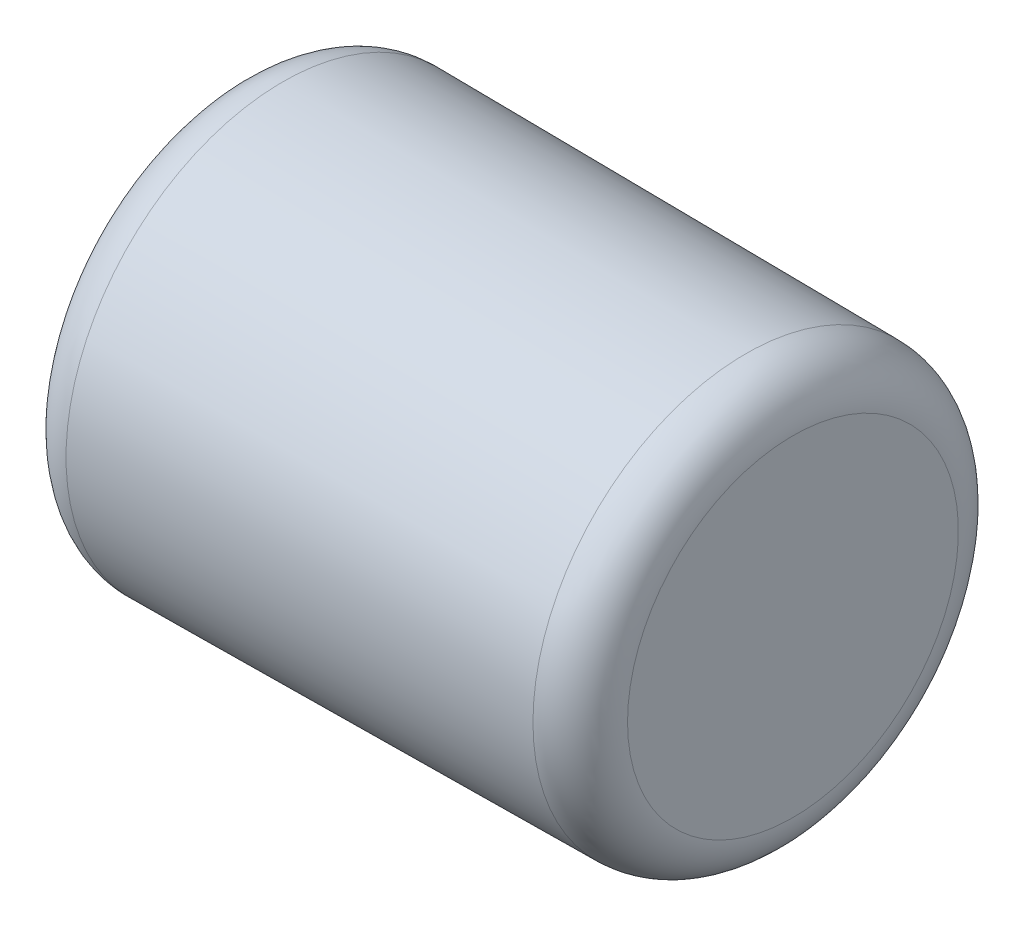
ISO-10303-21;
HEADER;
FILE_DESCRIPTION(('STEP AP214'),'2;1');
FILE_NAME('part.step','',(''),(''),'','','');
FILE_SCHEMA(('AUTOMOTIVE_DESIGN { 1 0 10303 214 1 1 1 1 }'));
ENDSEC;
DATA;
#1=APPLICATION_CONTEXT('core data for automotive mechanical design processes');
#2=APPLICATION_PROTOCOL_DEFINITION('international standard','automotive_design',2000,#1);
#3=PRODUCT_CONTEXT('',#1,'mechanical');
#4=PRODUCT('Part','Part','',(#3));
#5=PRODUCT_RELATED_PRODUCT_CATEGORY('part','',(#4));
#6=PRODUCT_DEFINITION_FORMATION('','',#4);
#7=PRODUCT_DEFINITION_CONTEXT('part definition',#1,'design');
#8=PRODUCT_DEFINITION('design','',#6,#7);
#9=PRODUCT_DEFINITION_SHAPE('','',#8);
#10=(LENGTH_UNIT() NAMED_UNIT(*) SI_UNIT(.MILLI.,.METRE.));
#11=(NAMED_UNIT(*) PLANE_ANGLE_UNIT() SI_UNIT($,.RADIAN.));
#12=(NAMED_UNIT(*) SI_UNIT($,.STERADIAN.) SOLID_ANGLE_UNIT());
#13=UNCERTAINTY_MEASURE_WITH_UNIT(LENGTH_MEASURE(1.E-05),#10,'distance_accuracy_value','');
#14=(GEOMETRIC_REPRESENTATION_CONTEXT(3) GLOBAL_UNCERTAINTY_ASSIGNED_CONTEXT((#13)) GLOBAL_UNIT_ASSIGNED_CONTEXT((#10,
#11,#12)) REPRESENTATION_CONTEXT('',''));
#15=CARTESIAN_POINT('',(0.,0.,0.));
#16=DIRECTION('',(0.,0.,1.));
#17=DIRECTION('',(1.,0.,0.));
#18=AXIS2_PLACEMENT_3D('',#15,#16,#17);
#19=CARTESIAN_POINT('',(0.,0.,0.));
#20=DIRECTION('',(1.,0.,0.));
#21=DIRECTION('',(0.,0.,-1.));
#22=AXIS2_PLACEMENT_3D('',#19,#20,#21);
#23=PLANE('',#22);
#24=CARTESIAN_POINT('',(0.,0.,0.));
#25=DIRECTION('',(1.,0.,0.));
#26=DIRECTION('',(0.,0.,-1.));
#27=AXIS2_PLACEMENT_3D('',#24,#25,#26);
#28=CIRCLE('',#27,7.13290629375153);
#29=CARTESIAN_POINT('',(0.,0.,-7.13290629375153));
#30=VERTEX_POINT('',#29);
#31=EDGE_CURVE('E10',#30,#30,#28,.F.);
#32=ORIENTED_EDGE('',*,*,#31,.T.);
#33=EDGE_LOOP('',(#32));
#34=FACE_BOUND('',#33,.T.);
#35=ADVANCED_FACE('F31',(#34),#23,.F.);
#36=CARTESIAN_POINT('',(23.5,0.,0.));
#37=DIRECTION('',(-1.,0.,0.));
#38=DIRECTION('',(0.,0.,1.));
#39=AXIS2_PLACEMENT_3D('',#36,#37,#38);
#40=CONICAL_SURFACE('',#39,8.95,0.00851043282888895);
#41=CARTESIAN_POINT('',(21.5170206601956,0.,0.));
#42=DIRECTION('',(1.,0.,0.));
#43=DIRECTION('',(0.,0.,-1.));
#44=AXIS2_PLACEMENT_3D('',#41,#42,#43);
#45=CIRCLE('',#44,8.96687641991323);
#46=CARTESIAN_POINT('',(21.5170206601956,0.,-8.96687641991323));
#47=VERTEX_POINT('',#46);
#48=EDGE_CURVE('E42',#47,#47,#45,.F.);
#49=ORIENTED_EDGE('',*,*,#48,.T.);
#50=EDGE_LOOP('',(#49));
#51=FACE_BOUND('',#50,.T.);
#52=CARTESIAN_POINT('',(2.01702066019549,0.,0.));
#53=DIRECTION('',(1.,0.,0.));
#54=DIRECTION('',(0.,0.,-1.));
#55=AXIS2_PLACEMENT_3D('',#52,#53,#54);
#56=CIRCLE('',#55,9.13283386672174);
#57=CARTESIAN_POINT('',(2.01702066019549,0.,-9.13283386672174));
#58=VERTEX_POINT('',#57);
#59=EDGE_CURVE('E46',#58,#58,#56,.T.);
#60=ORIENTED_EDGE('',*,*,#59,.T.);
#61=EDGE_LOOP('',(#60));
#62=FACE_BOUND('',#61,.T.);
#63=ADVANCED_FACE('F52',(#51,#62),#40,.T.);
#64=CARTESIAN_POINT('',(23.5,8.95,0.));
#65=DIRECTION('',(-1.,0.,0.));
#66=DIRECTION('',(0.,0.,1.));
#67=AXIS2_PLACEMENT_3D('',#64,#65,#66);
#68=PLANE('',#67);
#69=CARTESIAN_POINT('',(23.5,0.,0.));
#70=DIRECTION('',(-1.,0.,0.));
#71=DIRECTION('',(0.,0.,1.));
#72=AXIS2_PLACEMENT_3D('',#69,#70,#71);
#73=CIRCLE('',#72,6.96694884694302);
#74=CARTESIAN_POINT('',(23.5,0.,6.96694884694302));
#75=VERTEX_POINT('',#74);
#76=EDGE_CURVE('E38',#75,#75,#73,.F.);
#77=ORIENTED_EDGE('',*,*,#76,.T.);
#78=EDGE_LOOP('',(#77));
#79=FACE_BOUND('',#78,.T.);
#80=ADVANCED_FACE('F60',(#79),#68,.F.);
#81=CARTESIAN_POINT('',(21.5,0.,0.));
#82=DIRECTION('',(-1.,0.,0.));
#83=DIRECTION('',(0.,0.,1.));
#84=AXIS2_PLACEMENT_3D('',#81,#82,#83);
#85=TOROIDAL_SURFACE('',#84,6.96694884694302,2.);
#86=ORIENTED_EDGE('',*,*,#76,.F.);
#87=EDGE_LOOP('',(#86));
#88=FACE_BOUND('',#87,.T.);
#89=ORIENTED_EDGE('',*,*,#48,.F.);
#90=EDGE_LOOP('',(#89));
#91=FACE_BOUND('',#90,.T.);
#92=ADVANCED_FACE('F56',(#88,#91),#85,.T.);
#93=CARTESIAN_POINT('',(2.,0.,0.));
#94=DIRECTION('',(1.,0.,0.));
#95=DIRECTION('',(0.,0.,-1.));
#96=AXIS2_PLACEMENT_3D('',#93,#94,#95);
#97=TOROIDAL_SURFACE('',#96,7.13290629375153,2.);
#98=ORIENTED_EDGE('',*,*,#59,.F.);
#99=EDGE_LOOP('',(#98));
#100=FACE_BOUND('',#99,.T.);
#101=ORIENTED_EDGE('',*,*,#31,.F.);
#102=EDGE_LOOP('',(#101));
#103=FACE_BOUND('',#102,.T.);
#104=ADVANCED_FACE('F33',(#100,#103),#97,.T.);
#105=CLOSED_SHELL('',(#35,#63,#80,#92,#104));
#106=MANIFOLD_SOLID_BREP('B2',#105);
#107=ADVANCED_BREP_SHAPE_REPRESENTATION('',(#18,#106),#14);
#108=SHAPE_DEFINITION_REPRESENTATION(#9,#107);
ENDSEC;
END-ISO-10303-21;
